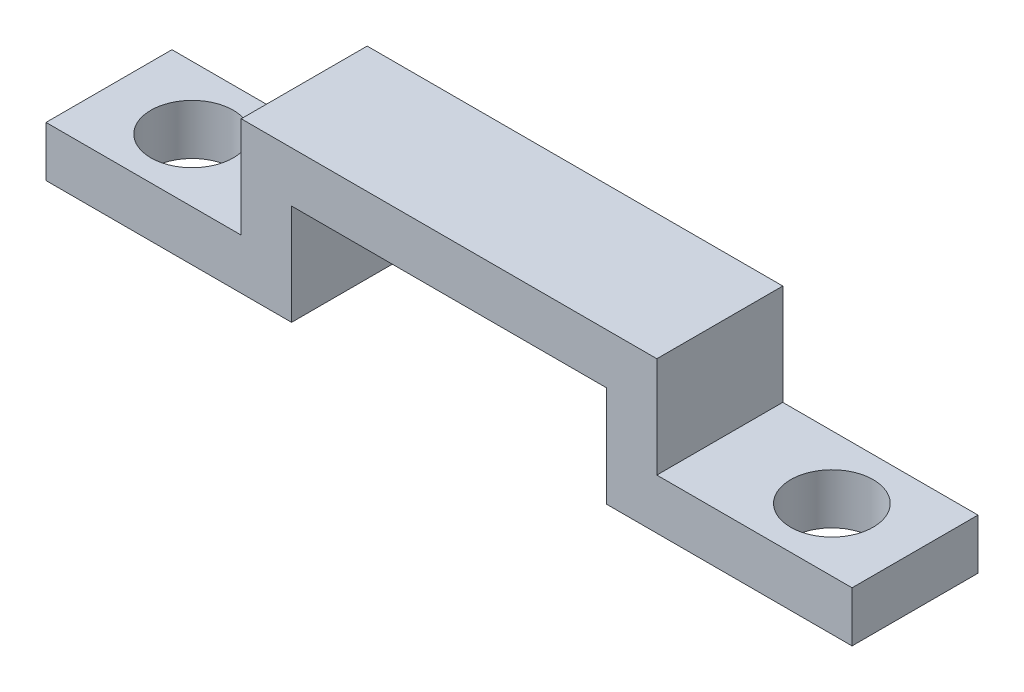
ISO-10303-21;
HEADER;
FILE_DESCRIPTION(('STEP AP214'),'2;1');
FILE_NAME('part.step','',(''),(''),'','','');
FILE_SCHEMA(('AUTOMOTIVE_DESIGN { 1 0 10303 214 1 1 1 1 }'));
ENDSEC;
DATA;
#1=APPLICATION_CONTEXT('core data for automotive mechanical design processes');
#2=APPLICATION_PROTOCOL_DEFINITION('international standard','automotive_design',2000,#1);
#3=PRODUCT_CONTEXT('',#1,'mechanical');
#4=PRODUCT('Part','Part','',(#3));
#5=PRODUCT_RELATED_PRODUCT_CATEGORY('part','',(#4));
#6=PRODUCT_DEFINITION_FORMATION('','',#4);
#7=PRODUCT_DEFINITION_CONTEXT('part definition',#1,'design');
#8=PRODUCT_DEFINITION('design','',#6,#7);
#9=PRODUCT_DEFINITION_SHAPE('','',#8);
#10=(LENGTH_UNIT() NAMED_UNIT(*) SI_UNIT(.MILLI.,.METRE.));
#11=(NAMED_UNIT(*) PLANE_ANGLE_UNIT() SI_UNIT($,.RADIAN.));
#12=(NAMED_UNIT(*) SI_UNIT($,.STERADIAN.) SOLID_ANGLE_UNIT());
#13=UNCERTAINTY_MEASURE_WITH_UNIT(LENGTH_MEASURE(1.E-05),#10,'distance_accuracy_value','');
#14=(GEOMETRIC_REPRESENTATION_CONTEXT(3) GLOBAL_UNCERTAINTY_ASSIGNED_CONTEXT((#13)) GLOBAL_UNIT_ASSIGNED_CONTEXT((#10,
#11,#12)) REPRESENTATION_CONTEXT('',''));
#15=CARTESIAN_POINT('',(0.,0.,0.));
#16=DIRECTION('',(0.,0.,1.));
#17=DIRECTION('',(1.,0.,0.));
#18=AXIS2_PLACEMENT_3D('',#15,#16,#17);
#19=CARTESIAN_POINT('',(-16.,2.,5.));
#20=DIRECTION('',(1.,0.,0.));
#21=DIRECTION('',(0.,0.,-1.));
#22=AXIS2_PLACEMENT_3D('',#19,#20,#21);
#23=PLANE('',#22);
#24=DIRECTION('',(0.,-1.,0.));
#25=VECTOR('',#24,1.);
#26=CARTESIAN_POINT('',(-16.,2.,0.));
#27=LINE('',#26,#25);
#28=CARTESIAN_POINT('',(-16.,2.,0.));
#29=VERTEX_POINT('',#28);
#30=CARTESIAN_POINT('',(-16.,0.,0.));
#31=VERTEX_POINT('',#30);
#32=EDGE_CURVE('E151',#29,#31,#27,.T.);
#33=ORIENTED_EDGE('',*,*,#32,.T.);
#34=DIRECTION('',(0.,0.,-1.));
#35=VECTOR('',#34,1.);
#36=CARTESIAN_POINT('',(-16.,0.,5.));
#37=LINE('',#36,#35);
#38=CARTESIAN_POINT('',(-16.,0.,5.));
#39=VERTEX_POINT('',#38);
#40=EDGE_CURVE('E11',#39,#31,#37,.T.);
#41=ORIENTED_EDGE('',*,*,#40,.F.);
#42=DIRECTION('',(0.,-1.,0.));
#43=VECTOR('',#42,1.);
#44=CARTESIAN_POINT('',(-16.,2.,5.));
#45=LINE('',#44,#43);
#46=CARTESIAN_POINT('',(-16.,2.,5.));
#47=VERTEX_POINT('',#46);
#48=EDGE_CURVE('E176',#47,#39,#45,.T.);
#49=ORIENTED_EDGE('',*,*,#48,.F.);
#50=DIRECTION('',(0.,0.,-1.));
#51=VECTOR('',#50,1.);
#52=CARTESIAN_POINT('',(-16.,2.,5.));
#53=LINE('',#52,#51);
#54=EDGE_CURVE('E147',#47,#29,#53,.T.);
#55=ORIENTED_EDGE('',*,*,#54,.T.);
#56=EDGE_LOOP('',(#33,#41,#49,#55));
#57=FACE_BOUND('',#56,.T.);
#58=ADVANCED_FACE('F32',(#57),#23,.F.);
#59=CARTESIAN_POINT('',(-16.,0.,5.));
#60=DIRECTION('',(0.,1.,0.));
#61=DIRECTION('',(0.,0.,1.));
#62=AXIS2_PLACEMENT_3D('',#59,#60,#61);
#63=PLANE('',#62);
#64=CARTESIAN_POINT('',(-12.7,0.,2.5));
#65=DIRECTION('',(0.,1.,0.));
#66=DIRECTION('',(0.,0.,1.));
#67=AXIS2_PLACEMENT_3D('',#64,#65,#66);
#68=CIRCLE('',#67,1.6383);
#69=CARTESIAN_POINT('',(-12.7,0.,4.1383));
#70=VERTEX_POINT('',#69);
#71=EDGE_CURVE('E155',#70,#70,#68,.T.);
#72=ORIENTED_EDGE('',*,*,#71,.T.);
#73=EDGE_LOOP('',(#72));
#74=FACE_BOUND('',#73,.T.);
#75=DIRECTION('',(1.,0.,0.));
#76=VECTOR('',#75,1.);
#77=CARTESIAN_POINT('',(-16.,0.,0.));
#78=LINE('',#77,#76);
#79=CARTESIAN_POINT('',(-6.25,0.,0.));
#80=VERTEX_POINT('',#79);
#81=EDGE_CURVE('E154',#31,#80,#78,.T.);
#82=ORIENTED_EDGE('',*,*,#81,.T.);
#83=DIRECTION('',(0.,0.,-1.));
#84=VECTOR('',#83,1.);
#85=CARTESIAN_POINT('',(-6.25,0.,5.));
#86=LINE('',#85,#84);
#87=CARTESIAN_POINT('',(-6.25,0.,5.));
#88=VERTEX_POINT('',#87);
#89=EDGE_CURVE('E40',#88,#80,#86,.T.);
#90=ORIENTED_EDGE('',*,*,#89,.F.);
#91=DIRECTION('',(1.,0.,0.));
#92=VECTOR('',#91,1.);
#93=CARTESIAN_POINT('',(-16.,0.,5.));
#94=LINE('',#93,#92);
#95=EDGE_CURVE('E103',#39,#88,#94,.T.);
#96=ORIENTED_EDGE('',*,*,#95,.F.);
#97=ORIENTED_EDGE('',*,*,#40,.T.);
#98=EDGE_LOOP('',(#82,#90,#96,#97));
#99=FACE_BOUND('',#98,.T.);
#100=ADVANCED_FACE('F256',(#74,#99),#63,.F.);
#101=CARTESIAN_POINT('',(-6.25,0.,5.));
#102=DIRECTION('',(-1.,0.,0.));
#103=DIRECTION('',(0.,0.,1.));
#104=AXIS2_PLACEMENT_3D('',#101,#102,#103);
#105=PLANE('',#104);
#106=DIRECTION('',(0.,1.,0.));
#107=VECTOR('',#106,1.);
#108=CARTESIAN_POINT('',(-6.25,0.,0.));
#109=LINE('',#108,#107);
#110=CARTESIAN_POINT('',(-6.25,4.,0.));
#111=VERTEX_POINT('',#110);
#112=EDGE_CURVE('E157',#80,#111,#109,.T.);
#113=ORIENTED_EDGE('',*,*,#112,.T.);
#114=DIRECTION('',(0.,0.,-1.));
#115=VECTOR('',#114,1.);
#116=CARTESIAN_POINT('',(-6.25,4.,5.));
#117=LINE('',#116,#115);
#118=CARTESIAN_POINT('',(-6.25,4.,5.));
#119=VERTEX_POINT('',#118);
#120=EDGE_CURVE('E195',#119,#111,#117,.T.);
#121=ORIENTED_EDGE('',*,*,#120,.F.);
#122=DIRECTION('',(0.,1.,0.));
#123=VECTOR('',#122,1.);
#124=CARTESIAN_POINT('',(-6.25,0.,5.));
#125=LINE('',#124,#123);
#126=EDGE_CURVE('E203',#88,#119,#125,.T.);
#127=ORIENTED_EDGE('',*,*,#126,.F.);
#128=ORIENTED_EDGE('',*,*,#89,.T.);
#129=EDGE_LOOP('',(#113,#121,#127,#128));
#130=FACE_BOUND('',#129,.T.);
#131=ADVANCED_FACE('F201',(#130),#105,.F.);
#132=CARTESIAN_POINT('',(6.25,4.,5.));
#133=DIRECTION('',(0.,1.,0.));
#134=DIRECTION('',(0.,0.,1.));
#135=AXIS2_PLACEMENT_3D('',#132,#133,#134);
#136=PLANE('',#135);
#137=DIRECTION('',(1.,0.,0.));
#138=VECTOR('',#137,1.);
#139=CARTESIAN_POINT('',(6.25,4.,0.));
#140=LINE('',#139,#138);
#141=CARTESIAN_POINT('',(6.25,4.,0.));
#142=VERTEX_POINT('',#141);
#143=EDGE_CURVE('E160',#111,#142,#140,.T.);
#144=ORIENTED_EDGE('',*,*,#143,.T.);
#145=DIRECTION('',(0.,0.,-1.));
#146=VECTOR('',#145,1.);
#147=CARTESIAN_POINT('',(6.25,4.,5.));
#148=LINE('',#147,#146);
#149=CARTESIAN_POINT('',(6.25,4.,5.));
#150=VERTEX_POINT('',#149);
#151=EDGE_CURVE('E192',#150,#142,#148,.T.);
#152=ORIENTED_EDGE('',*,*,#151,.F.);
#153=DIRECTION('',(1.,0.,0.));
#154=VECTOR('',#153,1.);
#155=CARTESIAN_POINT('',(-6.25,4.,5.));
#156=LINE('',#155,#154);
#157=EDGE_CURVE('E220',#119,#150,#156,.T.);
#158=ORIENTED_EDGE('',*,*,#157,.F.);
#159=ORIENTED_EDGE('',*,*,#120,.T.);
#160=EDGE_LOOP('',(#144,#152,#158,#159));
#161=FACE_BOUND('',#160,.T.);
#162=ADVANCED_FACE('F211',(#161),#136,.F.);
#163=CARTESIAN_POINT('',(6.25,0.,5.));
#164=DIRECTION('',(1.,0.,0.));
#165=DIRECTION('',(0.,0.,-1.));
#166=AXIS2_PLACEMENT_3D('',#163,#164,#165);
#167=PLANE('',#166);
#168=DIRECTION('',(0.,-1.,0.));
#169=VECTOR('',#168,1.);
#170=CARTESIAN_POINT('',(6.25,0.,0.));
#171=LINE('',#170,#169);
#172=CARTESIAN_POINT('',(6.25,0.,0.));
#173=VERTEX_POINT('',#172);
#174=EDGE_CURVE('E162',#142,#173,#171,.T.);
#175=ORIENTED_EDGE('',*,*,#174,.T.);
#176=DIRECTION('',(0.,0.,-1.));
#177=VECTOR('',#176,1.);
#178=CARTESIAN_POINT('',(6.25,0.,5.));
#179=LINE('',#178,#177);
#180=CARTESIAN_POINT('',(6.25,0.,5.));
#181=VERTEX_POINT('',#180);
#182=EDGE_CURVE('E189',#181,#173,#179,.T.);
#183=ORIENTED_EDGE('',*,*,#182,.F.);
#184=DIRECTION('',(0.,-1.,0.));
#185=VECTOR('',#184,1.);
#186=CARTESIAN_POINT('',(6.25,0.,5.));
#187=LINE('',#186,#185);
#188=EDGE_CURVE('E217',#150,#181,#187,.T.);
#189=ORIENTED_EDGE('',*,*,#188,.F.);
#190=ORIENTED_EDGE('',*,*,#151,.T.);
#191=EDGE_LOOP('',(#175,#183,#189,#190));
#192=FACE_BOUND('',#191,.T.);
#193=ADVANCED_FACE('F215',(#192),#167,.F.);
#194=CARTESIAN_POINT('',(16.,0.,5.));
#195=DIRECTION('',(0.,1.,0.));
#196=DIRECTION('',(0.,0.,1.));
#197=AXIS2_PLACEMENT_3D('',#194,#195,#196);
#198=PLANE('',#197);
#199=CARTESIAN_POINT('',(12.7,0.,2.49999999999999));
#200=DIRECTION('',(0.,1.,0.));
#201=DIRECTION('',(0.,0.,1.));
#202=AXIS2_PLACEMENT_3D('',#199,#200,#201);
#203=CIRCLE('',#202,1.6383);
#204=CARTESIAN_POINT('',(12.7,0.,4.13829999999999));
#205=VERTEX_POINT('',#204);
#206=EDGE_CURVE('E361',#205,#205,#203,.T.);
#207=ORIENTED_EDGE('',*,*,#206,.T.);
#208=EDGE_LOOP('',(#207));
#209=FACE_BOUND('',#208,.T.);
#210=DIRECTION('',(1.,0.,0.));
#211=VECTOR('',#210,1.);
#212=CARTESIAN_POINT('',(16.,0.,0.));
#213=LINE('',#212,#211);
#214=CARTESIAN_POINT('',(16.,0.,0.));
#215=VERTEX_POINT('',#214);
#216=EDGE_CURVE('E164',#173,#215,#213,.T.);
#217=ORIENTED_EDGE('',*,*,#216,.T.);
#218=DIRECTION('',(0.,0.,-1.));
#219=VECTOR('',#218,1.);
#220=CARTESIAN_POINT('',(16.,0.,5.));
#221=LINE('',#220,#219);
#222=CARTESIAN_POINT('',(16.,0.,5.));
#223=VERTEX_POINT('',#222);
#224=EDGE_CURVE('E186',#223,#215,#221,.T.);
#225=ORIENTED_EDGE('',*,*,#224,.F.);
#226=DIRECTION('',(1.,0.,0.));
#227=VECTOR('',#226,1.);
#228=CARTESIAN_POINT('',(16.,0.,5.));
#229=LINE('',#228,#227);
#230=EDGE_CURVE('E219',#181,#223,#229,.T.);
#231=ORIENTED_EDGE('',*,*,#230,.F.);
#232=ORIENTED_EDGE('',*,*,#182,.T.);
#233=EDGE_LOOP('',(#217,#225,#231,#232));
#234=FACE_BOUND('',#233,.T.);
#235=ADVANCED_FACE('F271',(#209,#234),#198,.F.);
#236=CARTESIAN_POINT('',(16.,2.,5.));
#237=DIRECTION('',(-1.,0.,0.));
#238=DIRECTION('',(0.,0.,1.));
#239=AXIS2_PLACEMENT_3D('',#236,#237,#238);
#240=PLANE('',#239);
#241=DIRECTION('',(0.,1.,0.));
#242=VECTOR('',#241,1.);
#243=CARTESIAN_POINT('',(16.,2.,0.));
#244=LINE('',#243,#242);
#245=CARTESIAN_POINT('',(16.,2.,0.));
#246=VERTEX_POINT('',#245);
#247=EDGE_CURVE('E166',#215,#246,#244,.T.);
#248=ORIENTED_EDGE('',*,*,#247,.T.);
#249=DIRECTION('',(0.,0.,-1.));
#250=VECTOR('',#249,1.);
#251=CARTESIAN_POINT('',(16.,2.,5.));
#252=LINE('',#251,#250);
#253=CARTESIAN_POINT('',(16.,2.,5.));
#254=VERTEX_POINT('',#253);
#255=EDGE_CURVE('E183',#254,#246,#252,.T.);
#256=ORIENTED_EDGE('',*,*,#255,.F.);
#257=DIRECTION('',(0.,1.,0.));
#258=VECTOR('',#257,1.);
#259=CARTESIAN_POINT('',(16.,2.,5.));
#260=LINE('',#259,#258);
#261=EDGE_CURVE('E222',#223,#254,#260,.T.);
#262=ORIENTED_EDGE('',*,*,#261,.F.);
#263=ORIENTED_EDGE('',*,*,#224,.T.);
#264=EDGE_LOOP('',(#248,#256,#262,#263));
#265=FACE_BOUND('',#264,.T.);
#266=ADVANCED_FACE('F274',(#265),#240,.F.);
#267=CARTESIAN_POINT('',(16.,2.,5.));
#268=DIRECTION('',(0.,-1.,0.));
#269=DIRECTION('',(0.,0.,-1.));
#270=AXIS2_PLACEMENT_3D('',#267,#268,#269);
#271=PLANE('',#270);
#272=CARTESIAN_POINT('',(12.7,2.,2.49999999999999));
#273=DIRECTION('',(0.,1.,0.));
#274=DIRECTION('',(0.,0.,1.));
#275=AXIS2_PLACEMENT_3D('',#272,#273,#274);
#276=CIRCLE('',#275,1.6383);
#277=CARTESIAN_POINT('',(12.7,2.,4.13829999999999));
#278=VERTEX_POINT('',#277);
#279=EDGE_CURVE('E358',#278,#278,#276,.T.);
#280=ORIENTED_EDGE('',*,*,#279,.F.);
#281=EDGE_LOOP('',(#280));
#282=FACE_BOUND('',#281,.T.);
#283=DIRECTION('',(-1.,0.,0.));
#284=VECTOR('',#283,1.);
#285=CARTESIAN_POINT('',(16.,2.,0.));
#286=LINE('',#285,#284);
#287=CARTESIAN_POINT('',(8.25,2.,0.));
#288=VERTEX_POINT('',#287);
#289=EDGE_CURVE('E168',#246,#288,#286,.T.);
#290=ORIENTED_EDGE('',*,*,#289,.T.);
#291=DIRECTION('',(0.,0.,-1.));
#292=VECTOR('',#291,1.);
#293=CARTESIAN_POINT('',(8.25,2.,5.));
#294=LINE('',#293,#292);
#295=CARTESIAN_POINT('',(8.25,2.,5.));
#296=VERTEX_POINT('',#295);
#297=EDGE_CURVE('E180',#296,#288,#294,.T.);
#298=ORIENTED_EDGE('',*,*,#297,.F.);
#299=DIRECTION('',(-1.,0.,0.));
#300=VECTOR('',#299,1.);
#301=CARTESIAN_POINT('',(16.,2.,5.));
#302=LINE('',#301,#300);
#303=EDGE_CURVE('E228',#254,#296,#302,.T.);
#304=ORIENTED_EDGE('',*,*,#303,.F.);
#305=ORIENTED_EDGE('',*,*,#255,.T.);
#306=EDGE_LOOP('',(#290,#298,#304,#305));
#307=FACE_BOUND('',#306,.T.);
#308=ADVANCED_FACE('F234',(#282,#307),#271,.F.);
#309=CARTESIAN_POINT('',(8.25,2.,5.));
#310=DIRECTION('',(-1.,0.,0.));
#311=DIRECTION('',(0.,0.,1.));
#312=AXIS2_PLACEMENT_3D('',#309,#310,#311);
#313=PLANE('',#312);
#314=DIRECTION('',(0.,1.,0.));
#315=VECTOR('',#314,1.);
#316=CARTESIAN_POINT('',(8.25,2.,0.));
#317=LINE('',#316,#315);
#318=CARTESIAN_POINT('',(8.25,6.,0.));
#319=VERTEX_POINT('',#318);
#320=EDGE_CURVE('E170',#288,#319,#317,.T.);
#321=ORIENTED_EDGE('',*,*,#320,.T.);
#322=DIRECTION('',(0.,0.,-1.));
#323=VECTOR('',#322,1.);
#324=CARTESIAN_POINT('',(8.25,6.,5.));
#325=LINE('',#324,#323);
#326=CARTESIAN_POINT('',(8.25,6.,5.));
#327=VERTEX_POINT('',#326);
#328=EDGE_CURVE('E142',#327,#319,#325,.T.);
#329=ORIENTED_EDGE('',*,*,#328,.F.);
#330=DIRECTION('',(0.,1.,0.));
#331=VECTOR('',#330,1.);
#332=CARTESIAN_POINT('',(8.25,2.,5.));
#333=LINE('',#332,#331);
#334=EDGE_CURVE('E134',#296,#327,#333,.T.);
#335=ORIENTED_EDGE('',*,*,#334,.F.);
#336=ORIENTED_EDGE('',*,*,#297,.T.);
#337=EDGE_LOOP('',(#321,#329,#335,#336));
#338=FACE_BOUND('',#337,.T.);
#339=ADVANCED_FACE('F238',(#338),#313,.F.);
#340=CARTESIAN_POINT('',(-8.25,6.,5.));
#341=DIRECTION('',(0.,-1.,0.));
#342=DIRECTION('',(0.,0.,-1.));
#343=AXIS2_PLACEMENT_3D('',#340,#341,#342);
#344=PLANE('',#343);
#345=DIRECTION('',(-1.,0.,0.));
#346=VECTOR('',#345,1.);
#347=CARTESIAN_POINT('',(-8.25,6.,0.));
#348=LINE('',#347,#346);
#349=CARTESIAN_POINT('',(-8.25,6.,0.));
#350=VERTEX_POINT('',#349);
#351=EDGE_CURVE('E141',#319,#350,#348,.T.);
#352=ORIENTED_EDGE('',*,*,#351,.T.);
#353=DIRECTION('',(0.,0.,-1.));
#354=VECTOR('',#353,1.);
#355=CARTESIAN_POINT('',(-8.25,6.,5.));
#356=LINE('',#355,#354);
#357=CARTESIAN_POINT('',(-8.25,6.,5.));
#358=VERTEX_POINT('',#357);
#359=EDGE_CURVE('E139',#358,#350,#356,.T.);
#360=ORIENTED_EDGE('',*,*,#359,.F.);
#361=DIRECTION('',(-1.,0.,0.));
#362=VECTOR('',#361,1.);
#363=CARTESIAN_POINT('',(8.25,6.,5.));
#364=LINE('',#363,#362);
#365=EDGE_CURVE('E128',#327,#358,#364,.T.);
#366=ORIENTED_EDGE('',*,*,#365,.F.);
#367=ORIENTED_EDGE('',*,*,#328,.T.);
#368=EDGE_LOOP('',(#352,#360,#366,#367));
#369=FACE_BOUND('',#368,.T.);
#370=ADVANCED_FACE('F140',(#369),#344,.F.);
#371=CARTESIAN_POINT('',(-8.25,2.,5.));
#372=DIRECTION('',(1.,0.,0.));
#373=DIRECTION('',(0.,0.,-1.));
#374=AXIS2_PLACEMENT_3D('',#371,#372,#373);
#375=PLANE('',#374);
#376=DIRECTION('',(0.,-1.,0.));
#377=VECTOR('',#376,1.);
#378=CARTESIAN_POINT('',(-8.25,2.,0.));
#379=LINE('',#378,#377);
#380=CARTESIAN_POINT('',(-8.25,2.,0.));
#381=VERTEX_POINT('',#380);
#382=EDGE_CURVE('E89',#350,#381,#379,.T.);
#383=ORIENTED_EDGE('',*,*,#382,.T.);
#384=DIRECTION('',(0.,0.,-1.));
#385=VECTOR('',#384,1.);
#386=CARTESIAN_POINT('',(-8.25,2.,5.));
#387=LINE('',#386,#385);
#388=CARTESIAN_POINT('',(-8.25,2.,5.));
#389=VERTEX_POINT('',#388);
#390=EDGE_CURVE('E143',#389,#381,#387,.T.);
#391=ORIENTED_EDGE('',*,*,#390,.F.);
#392=DIRECTION('',(0.,-1.,0.));
#393=VECTOR('',#392,1.);
#394=CARTESIAN_POINT('',(-8.25,2.,5.));
#395=LINE('',#394,#393);
#396=EDGE_CURVE('E132',#358,#389,#395,.T.);
#397=ORIENTED_EDGE('',*,*,#396,.F.);
#398=ORIENTED_EDGE('',*,*,#359,.T.);
#399=EDGE_LOOP('',(#383,#391,#397,#398));
#400=FACE_BOUND('',#399,.T.);
#401=ADVANCED_FACE('F145',(#400),#375,.F.);
#402=CARTESIAN_POINT('',(-16.,2.,5.));
#403=DIRECTION('',(0.,-1.,0.));
#404=DIRECTION('',(0.,0.,-1.));
#405=AXIS2_PLACEMENT_3D('',#402,#403,#404);
#406=PLANE('',#405);
#407=CARTESIAN_POINT('',(-12.7,2.,2.5));
#408=DIRECTION('',(0.,1.,0.));
#409=DIRECTION('',(0.,0.,1.));
#410=AXIS2_PLACEMENT_3D('',#407,#408,#409);
#411=CIRCLE('',#410,1.6383);
#412=CARTESIAN_POINT('',(-12.7,2.,4.1383));
#413=VERTEX_POINT('',#412);
#414=EDGE_CURVE('E362',#413,#413,#411,.T.);
#415=ORIENTED_EDGE('',*,*,#414,.F.);
#416=EDGE_LOOP('',(#415));
#417=FACE_BOUND('',#416,.T.);
#418=DIRECTION('',(-1.,0.,0.));
#419=VECTOR('',#418,1.);
#420=CARTESIAN_POINT('',(-16.,2.,0.));
#421=LINE('',#420,#419);
#422=EDGE_CURVE('E95',#381,#29,#421,.T.);
#423=ORIENTED_EDGE('',*,*,#422,.T.);
#424=ORIENTED_EDGE('',*,*,#54,.F.);
#425=DIRECTION('',(-1.,0.,0.));
#426=VECTOR('',#425,1.);
#427=CARTESIAN_POINT('',(-16.,2.,5.));
#428=LINE('',#427,#426);
#429=EDGE_CURVE('E48',#389,#47,#428,.T.);
#430=ORIENTED_EDGE('',*,*,#429,.F.);
#431=ORIENTED_EDGE('',*,*,#390,.T.);
#432=EDGE_LOOP('',(#423,#424,#430,#431));
#433=FACE_BOUND('',#432,.T.);
#434=ADVANCED_FACE('F243',(#417,#433),#406,.F.);
#435=CARTESIAN_POINT('',(0.,0.,5.));
#436=DIRECTION('',(0.,0.,1.));
#437=DIRECTION('',(1.,0.,0.));
#438=AXIS2_PLACEMENT_3D('',#435,#436,#437);
#439=PLANE('',#438);
#440=ORIENTED_EDGE('',*,*,#48,.T.);
#441=ORIENTED_EDGE('',*,*,#95,.T.);
#442=ORIENTED_EDGE('',*,*,#126,.T.);
#443=ORIENTED_EDGE('',*,*,#157,.T.);
#444=ORIENTED_EDGE('',*,*,#188,.T.);
#445=ORIENTED_EDGE('',*,*,#230,.T.);
#446=ORIENTED_EDGE('',*,*,#261,.T.);
#447=ORIENTED_EDGE('',*,*,#303,.T.);
#448=ORIENTED_EDGE('',*,*,#334,.T.);
#449=ORIENTED_EDGE('',*,*,#365,.T.);
#450=ORIENTED_EDGE('',*,*,#396,.T.);
#451=ORIENTED_EDGE('',*,*,#429,.T.);
#452=EDGE_LOOP('',(#440,#441,#442,#443,#444,#445,#446,#447,#448,#449,#450,#451));
#453=FACE_BOUND('',#452,.T.);
#454=ADVANCED_FACE('F130',(#453),#439,.T.);
#455=CARTESIAN_POINT('',(0.,0.,0.));
#456=DIRECTION('',(0.,0.,1.));
#457=DIRECTION('',(1.,0.,0.));
#458=AXIS2_PLACEMENT_3D('',#455,#456,#457);
#459=PLANE('',#458);
#460=ORIENTED_EDGE('',*,*,#32,.F.);
#461=ORIENTED_EDGE('',*,*,#422,.F.);
#462=ORIENTED_EDGE('',*,*,#382,.F.);
#463=ORIENTED_EDGE('',*,*,#351,.F.);
#464=ORIENTED_EDGE('',*,*,#320,.F.);
#465=ORIENTED_EDGE('',*,*,#289,.F.);
#466=ORIENTED_EDGE('',*,*,#247,.F.);
#467=ORIENTED_EDGE('',*,*,#216,.F.);
#468=ORIENTED_EDGE('',*,*,#174,.F.);
#469=ORIENTED_EDGE('',*,*,#143,.F.);
#470=ORIENTED_EDGE('',*,*,#112,.F.);
#471=ORIENTED_EDGE('',*,*,#81,.F.);
#472=EDGE_LOOP('',(#460,#461,#462,#463,#464,#465,#466,#467,#468,#469,#470,#471));
#473=FACE_BOUND('',#472,.T.);
#474=ADVANCED_FACE('F206',(#473),#459,.F.);
#475=CARTESIAN_POINT('',(-12.7,-3.,2.5));
#476=DIRECTION('',(0.,1.,0.));
#477=DIRECTION('',(0.,0.,1.));
#478=AXIS2_PLACEMENT_3D('',#475,#476,#477);
#479=CYLINDRICAL_SURFACE('',#478,1.6383);
#480=ORIENTED_EDGE('',*,*,#414,.T.);
#481=EDGE_LOOP('',(#480));
#482=FACE_BOUND('',#481,.T.);
#483=ORIENTED_EDGE('',*,*,#71,.F.);
#484=EDGE_LOOP('',(#483));
#485=FACE_BOUND('',#484,.T.);
#486=ADVANCED_FACE('F308',(#482,#485),#479,.F.);
#487=CARTESIAN_POINT('',(12.7,-3.,2.49999999999999));
#488=DIRECTION('',(0.,1.,0.));
#489=DIRECTION('',(0.,0.,1.));
#490=AXIS2_PLACEMENT_3D('',#487,#488,#489);
#491=CYLINDRICAL_SURFACE('',#490,1.6383);
#492=ORIENTED_EDGE('',*,*,#279,.T.);
#493=EDGE_LOOP('',(#492));
#494=FACE_BOUND('',#493,.T.);
#495=ORIENTED_EDGE('',*,*,#206,.F.);
#496=EDGE_LOOP('',(#495));
#497=FACE_BOUND('',#496,.T.);
#498=ADVANCED_FACE('F341',(#494,#497),#491,.F.);
#499=CLOSED_SHELL('',(#58,#100,#131,#162,#193,#235,#266,#308,#339,#370,#401,#434,#454,#474,#486,#498));
#500=MANIFOLD_SOLID_BREP('B2',#499);
#501=ADVANCED_BREP_SHAPE_REPRESENTATION('',(#18,#500),#14);
#502=SHAPE_DEFINITION_REPRESENTATION(#9,#501);
ENDSEC;
END-ISO-10303-21;
